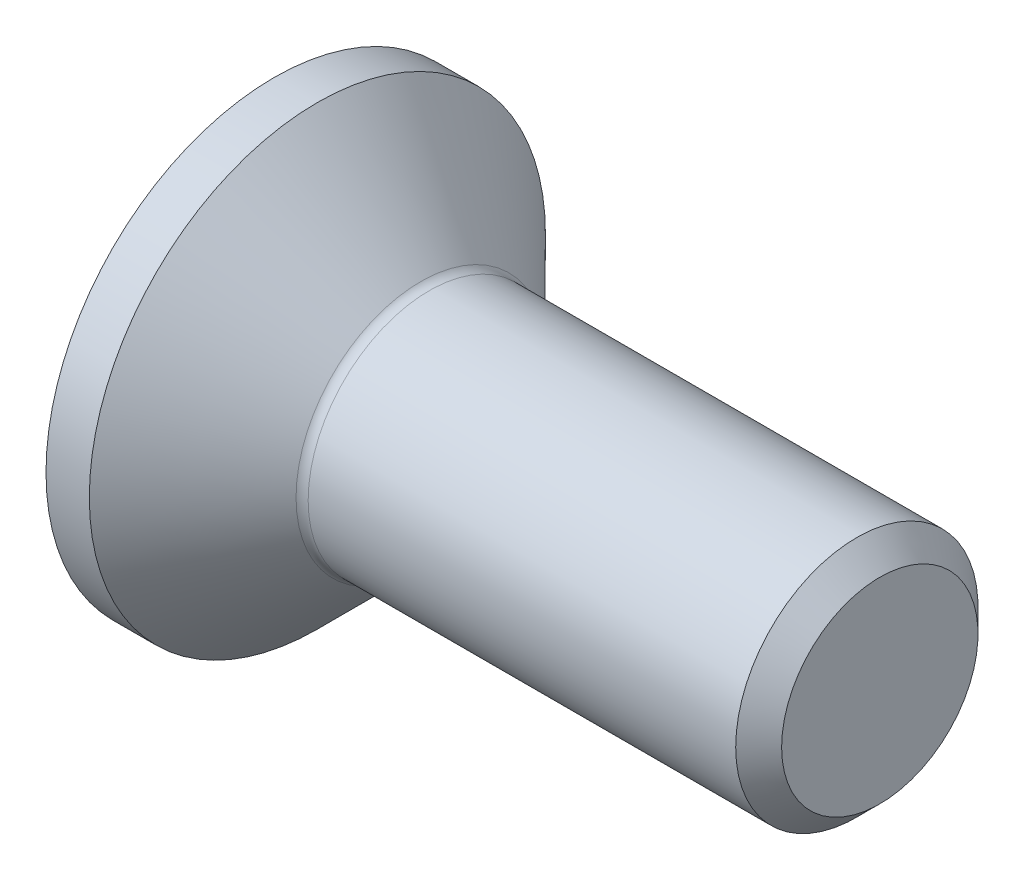
ISO-10303-21;
HEADER;
FILE_DESCRIPTION(('STEP AP214'),'2;1');
FILE_NAME('part.step','',(''),(''),'','','');
FILE_SCHEMA(('AUTOMOTIVE_DESIGN { 1 0 10303 214 1 1 1 1 }'));
ENDSEC;
DATA;
#1=APPLICATION_CONTEXT('core data for automotive mechanical design processes');
#2=APPLICATION_PROTOCOL_DEFINITION('international standard','automotive_design',2000,#1);
#3=PRODUCT_CONTEXT('',#1,'mechanical');
#4=PRODUCT('Part','Part','',(#3));
#5=PRODUCT_RELATED_PRODUCT_CATEGORY('part','',(#4));
#6=PRODUCT_DEFINITION_FORMATION('','',#4);
#7=PRODUCT_DEFINITION_CONTEXT('part definition',#1,'design');
#8=PRODUCT_DEFINITION('design','',#6,#7);
#9=PRODUCT_DEFINITION_SHAPE('','',#8);
#10=(LENGTH_UNIT() NAMED_UNIT(*) SI_UNIT(.MILLI.,.METRE.));
#11=(NAMED_UNIT(*) PLANE_ANGLE_UNIT() SI_UNIT($,.RADIAN.));
#12=(NAMED_UNIT(*) SI_UNIT($,.STERADIAN.) SOLID_ANGLE_UNIT());
#13=UNCERTAINTY_MEASURE_WITH_UNIT(LENGTH_MEASURE(1.E-05),#10,'distance_accuracy_value','');
#14=(GEOMETRIC_REPRESENTATION_CONTEXT(3) GLOBAL_UNCERTAINTY_ASSIGNED_CONTEXT((#13)) GLOBAL_UNIT_ASSIGNED_CONTEXT((#10,
#11,#12)) REPRESENTATION_CONTEXT('',''));
#15=CARTESIAN_POINT('',(0.,0.,0.));
#16=DIRECTION('',(0.,0.,1.));
#17=DIRECTION('',(1.,0.,0.));
#18=AXIS2_PLACEMENT_3D('',#15,#16,#17);
#19=CARTESIAN_POINT('',(10.,2.,0.));
#20=DIRECTION('',(-1.,0.,0.));
#21=DIRECTION('',(0.,0.,1.));
#22=AXIS2_PLACEMENT_3D('',#19,#20,#21);
#23=PLANE('',#22);
#24=CARTESIAN_POINT('',(10.,0.,0.));
#25=DIRECTION('',(-1.,0.,0.));
#26=DIRECTION('',(0.,0.,1.));
#27=AXIS2_PLACEMENT_3D('',#24,#25,#26);
#28=CIRCLE('',#27,1.62099999999999);
#29=CARTESIAN_POINT('',(10.,0.,1.62099999999999));
#30=VERTEX_POINT('',#29);
#31=EDGE_CURVE('E11',#30,#30,#28,.F.);
#32=ORIENTED_EDGE('',*,*,#31,.T.);
#33=EDGE_LOOP('',(#32));
#34=FACE_BOUND('',#33,.T.);
#35=ADVANCED_FACE('F34',(#34),#23,.F.);
#36=CARTESIAN_POINT('',(-0.587069180985524,0.,0.));
#37=DIRECTION('',(-1.,0.,0.));
#38=DIRECTION('',(0.,0.,1.));
#39=AXIS2_PLACEMENT_3D('',#36,#37,#38);
#40=CYLINDRICAL_SURFACE('',#39,2.);
#41=CARTESIAN_POINT('',(9.621,0.,0.));
#42=DIRECTION('',(-1.,0.,0.));
#43=DIRECTION('',(0.,0.,1.));
#44=AXIS2_PLACEMENT_3D('',#41,#42,#43);
#45=CIRCLE('',#44,2.);
#46=CARTESIAN_POINT('',(9.621,0.,2.));
#47=VERTEX_POINT('',#46);
#48=EDGE_CURVE('E43',#47,#47,#45,.T.);
#49=ORIENTED_EDGE('',*,*,#48,.T.);
#50=EDGE_LOOP('',(#49));
#51=FACE_BOUND('',#50,.T.);
#52=CARTESIAN_POINT('',(2.56284271247462,0.,0.));
#53=DIRECTION('',(-1.,0.,0.));
#54=DIRECTION('',(0.,0.,1.));
#55=AXIS2_PLACEMENT_3D('',#52,#53,#54);
#56=CIRCLE('',#55,2.);
#57=CARTESIAN_POINT('',(2.56284271247462,0.,2.));
#58=VERTEX_POINT('',#57);
#59=EDGE_CURVE('E147',#58,#58,#56,.F.);
#60=ORIENTED_EDGE('',*,*,#59,.T.);
#61=EDGE_LOOP('',(#60));
#62=FACE_BOUND('',#61,.T.);
#63=ADVANCED_FACE('F125',(#51,#62),#40,.T.);
#64=CARTESIAN_POINT('',(2.48,0.,0.));
#65=DIRECTION('',(-1.,0.,0.));
#66=DIRECTION('',(0.,0.,1.));
#67=AXIS2_PLACEMENT_3D('',#64,#65,#66);
#68=CONICAL_SURFACE('',#67,2.,0.785398163397448);
#69=CARTESIAN_POINT('',(0.714999999999993,0.,0.));
#70=DIRECTION('',(-1.,0.,0.));
#71=DIRECTION('',(0.,0.,1.));
#72=AXIS2_PLACEMENT_3D('',#69,#70,#71);
#73=CIRCLE('',#72,3.765);
#74=CARTESIAN_POINT('',(0.714999999999993,0.,3.765));
#75=VERTEX_POINT('',#74);
#76=EDGE_CURVE('E38',#75,#75,#73,.F.);
#77=ORIENTED_EDGE('',*,*,#76,.T.);
#78=EDGE_LOOP('',(#77));
#79=FACE_BOUND('',#78,.T.);
#80=CARTESIAN_POINT('',(2.42142135623731,0.,0.));
#81=DIRECTION('',(-1.,0.,0.));
#82=DIRECTION('',(0.,0.,1.));
#83=AXIS2_PLACEMENT_3D('',#80,#81,#82);
#84=CIRCLE('',#83,2.05857864376269);
#85=CARTESIAN_POINT('',(2.42142135623731,0.,2.05857864376269));
#86=VERTEX_POINT('',#85);
#87=EDGE_CURVE('E150',#86,#86,#84,.T.);
#88=ORIENTED_EDGE('',*,*,#87,.T.);
#89=EDGE_LOOP('',(#88));
#90=FACE_BOUND('',#89,.T.);
#91=ADVANCED_FACE('F131',(#79,#90),#68,.T.);
#92=CARTESIAN_POINT('',(2.56284271247462,0.,0.));
#93=DIRECTION('',(-1.,0.,0.));
#94=DIRECTION('',(0.,0.,1.));
#95=AXIS2_PLACEMENT_3D('',#92,#93,#94);
#96=TOROIDAL_SURFACE('',#95,2.2,0.2);
#97=ORIENTED_EDGE('',*,*,#59,.F.);
#98=EDGE_LOOP('',(#97));
#99=FACE_BOUND('',#98,.T.);
#100=ORIENTED_EDGE('',*,*,#87,.F.);
#101=EDGE_LOOP('',(#100));
#102=FACE_BOUND('',#101,.T.);
#103=ADVANCED_FACE('F135',(#99,#102),#96,.F.);
#104=CARTESIAN_POINT('',(9.621,0.,0.));
#105=DIRECTION('',(-1.,0.,0.));
#106=DIRECTION('',(0.,0.,1.));
#107=AXIS2_PLACEMENT_3D('',#104,#105,#106);
#108=CONICAL_SURFACE('',#107,2.,0.785398163397452);
#109=ORIENTED_EDGE('',*,*,#31,.F.);
#110=EDGE_LOOP('',(#109));
#111=FACE_BOUND('',#110,.T.);
#112=ORIENTED_EDGE('',*,*,#48,.F.);
#113=EDGE_LOOP('',(#112));
#114=FACE_BOUND('',#113,.T.);
#115=ADVANCED_FACE('F36',(#111,#114),#108,.T.);
#116=CARTESIAN_POINT('',(11.8531386861314,0.,0.));
#117=DIRECTION('',(1.,0.,0.));
#118=DIRECTION('',(0.,0.,-1.));
#119=AXIS2_PLACEMENT_3D('',#116,#117,#118);
#120=CYLINDRICAL_SURFACE('',#119,3.765);
#121=ORIENTED_EDGE('',*,*,#76,.F.);
#122=EDGE_LOOP('',(#121));
#123=FACE_BOUND('',#122,.T.);
#124=CARTESIAN_POINT('',(0.,0.,0.));
#125=DIRECTION('',(1.,0.,0.));
#126=DIRECTION('',(0.,0.,-1.));
#127=AXIS2_PLACEMENT_3D('',#124,#125,#126);
#128=CIRCLE('',#127,3.765);
#129=CARTESIAN_POINT('',(0.,0.,-3.765));
#130=VERTEX_POINT('',#129);
#131=EDGE_CURVE('E217',#130,#130,#128,.F.);
#132=ORIENTED_EDGE('',*,*,#131,.F.);
#133=EDGE_LOOP('',(#132));
#134=FACE_BOUND('',#133,.T.);
#135=ADVANCED_FACE('F112',(#123,#134),#120,.T.);
#136=CARTESIAN_POINT('',(2.22168783648704,0.,0.));
#137=DIRECTION('',(-1.,0.,0.));
#138=DIRECTION('',(0.,0.,1.));
#139=AXIS2_PLACEMENT_3D('',#136,#137,#138);
#140=CONICAL_SURFACE('',#139,0.,1.04719755119659);
#141=CARTESIAN_POINT('',(1.5,0.,0.));
#142=DIRECTION('',(-1.,0.,0.));
#143=DIRECTION('',(0.,0.,1.));
#144=AXIS2_PLACEMENT_3D('',#141,#142,#143);
#145=CIRCLE('',#144,1.25);
#146=CARTESIAN_POINT('',(1.5,0.625000000000001,1.08253175473055));
#147=VERTEX_POINT('',#146);
#148=CARTESIAN_POINT('',(1.5,1.25,0.));
#149=VERTEX_POINT('',#148);
#150=EDGE_CURVE('E157',#147,#149,#145,.T.);
#151=ORIENTED_EDGE('',*,*,#150,.T.);
#152=CARTESIAN_POINT('',(1.5,0.625000000000001,-1.08253175473055));
#153=VERTEX_POINT('',#152);
#154=EDGE_CURVE('E152',#149,#153,#145,.T.);
#155=ORIENTED_EDGE('',*,*,#154,.T.);
#156=CARTESIAN_POINT('',(1.5,-0.625,-1.08253175473055));
#157=VERTEX_POINT('',#156);
#158=EDGE_CURVE('E155',#153,#157,#145,.T.);
#159=ORIENTED_EDGE('',*,*,#158,.T.);
#160=CARTESIAN_POINT('',(1.5,-1.25,0.));
#161=VERTEX_POINT('',#160);
#162=EDGE_CURVE('E242',#157,#161,#145,.T.);
#163=ORIENTED_EDGE('',*,*,#162,.T.);
#164=CARTESIAN_POINT('',(1.5,-0.625,1.08253175473055));
#165=VERTEX_POINT('',#164);
#166=EDGE_CURVE('E50',#161,#165,#145,.T.);
#167=ORIENTED_EDGE('',*,*,#166,.T.);
#168=EDGE_CURVE('E166',#165,#147,#145,.T.);
#169=ORIENTED_EDGE('',*,*,#168,.T.);
#170=EDGE_LOOP('',(#151,#155,#159,#163,#167,#169));
#171=FACE_BOUND('',#170,.T.);
#172=CARTESIAN_POINT('',(2.22168783648704,0.,0.));
#173=VERTEX_POINT('',#172);
#174=VERTEX_LOOP('',#173);
#175=FACE_BOUND('',#174,.T.);
#176=ADVANCED_FACE('F109',(#171,#175),#140,.F.);
#177=CARTESIAN_POINT('',(1.5,-2.5,0.));
#178=DIRECTION('',(-1.,0.,0.));
#179=DIRECTION('',(0.,0.,1.));
#180=AXIS2_PLACEMENT_3D('',#177,#178,#179);
#181=PLANE('',#180);
#182=ORIENTED_EDGE('',*,*,#166,.F.);
#183=DIRECTION('',(0.,0.,-1.));
#184=VECTOR('',#183,1.);
#185=CARTESIAN_POINT('',(1.5,-1.25,0.721687836487031));
#186=LINE('',#185,#184);
#187=CARTESIAN_POINT('',(1.5,-1.25,0.721687836487031));
#188=VERTEX_POINT('',#187);
#189=EDGE_CURVE('E177',#188,#161,#186,.T.);
#190=ORIENTED_EDGE('',*,*,#189,.F.);
#191=DIRECTION('',(0.,-0.866025403784438,-0.5));
#192=VECTOR('',#191,1.);
#193=CARTESIAN_POINT('',(1.5,0.,1.44337567297406));
#194=LINE('',#193,#192);
#195=EDGE_CURVE('E201',#165,#188,#194,.T.);
#196=ORIENTED_EDGE('',*,*,#195,.F.);
#197=EDGE_LOOP('',(#182,#190,#196));
#198=FACE_BOUND('',#197,.T.);
#199=ADVANCED_FACE('F111',(#198),#181,.T.);
#200=ORIENTED_EDGE('',*,*,#168,.F.);
#201=CARTESIAN_POINT('',(1.5,0.,1.44337567297406));
#202=VERTEX_POINT('',#201);
#203=EDGE_CURVE('E198',#202,#165,#194,.T.);
#204=ORIENTED_EDGE('',*,*,#203,.F.);
#205=DIRECTION('',(0.,-0.866025403784438,0.5));
#206=VECTOR('',#205,1.);
#207=CARTESIAN_POINT('',(1.5,1.25,0.721687836487031));
#208=LINE('',#207,#206);
#209=EDGE_CURVE('E205',#147,#202,#208,.T.);
#210=ORIENTED_EDGE('',*,*,#209,.F.);
#211=EDGE_LOOP('',(#200,#204,#210));
#212=FACE_BOUND('',#211,.T.);
#213=ADVANCED_FACE('F118',(#212),#181,.T.);
#214=ORIENTED_EDGE('',*,*,#150,.F.);
#215=CARTESIAN_POINT('',(1.5,1.25,0.721687836487031));
#216=VERTEX_POINT('',#215);
#217=EDGE_CURVE('E202',#216,#147,#208,.T.);
#218=ORIENTED_EDGE('',*,*,#217,.F.);
#219=DIRECTION('',(0.,0.,1.));
#220=VECTOR('',#219,1.);
#221=CARTESIAN_POINT('',(1.5,1.25,-0.72168783648703));
#222=LINE('',#221,#220);
#223=EDGE_CURVE('E209',#149,#216,#222,.T.);
#224=ORIENTED_EDGE('',*,*,#223,.F.);
#225=EDGE_LOOP('',(#214,#218,#224));
#226=FACE_BOUND('',#225,.T.);
#227=ADVANCED_FACE('F273',(#226),#181,.T.);
#228=ORIENTED_EDGE('',*,*,#154,.F.);
#229=CARTESIAN_POINT('',(1.5,1.25,-0.72168783648703));
#230=VERTEX_POINT('',#229);
#231=EDGE_CURVE('E206',#230,#149,#222,.T.);
#232=ORIENTED_EDGE('',*,*,#231,.F.);
#233=DIRECTION('',(0.,0.866025403784438,0.5));
#234=VECTOR('',#233,1.);
#235=CARTESIAN_POINT('',(1.5,0.,-1.44337567297406));
#236=LINE('',#235,#234);
#237=EDGE_CURVE('E213',#153,#230,#236,.T.);
#238=ORIENTED_EDGE('',*,*,#237,.F.);
#239=EDGE_LOOP('',(#228,#232,#238));
#240=FACE_BOUND('',#239,.T.);
#241=ADVANCED_FACE('F278',(#240),#181,.T.);
#242=ORIENTED_EDGE('',*,*,#158,.F.);
#243=CARTESIAN_POINT('',(1.5,0.,-1.44337567297406));
#244=VERTEX_POINT('',#243);
#245=EDGE_CURVE('E210',#244,#153,#236,.T.);
#246=ORIENTED_EDGE('',*,*,#245,.F.);
#247=DIRECTION('',(0.,0.866025403784439,-0.5));
#248=VECTOR('',#247,1.);
#249=CARTESIAN_POINT('',(1.5,-1.25,-0.721687836487035));
#250=LINE('',#249,#248);
#251=EDGE_CURVE('E181',#157,#244,#250,.T.);
#252=ORIENTED_EDGE('',*,*,#251,.F.);
#253=EDGE_LOOP('',(#242,#246,#252));
#254=FACE_BOUND('',#253,.T.);
#255=ADVANCED_FACE('F247',(#254),#181,.T.);
#256=ORIENTED_EDGE('',*,*,#162,.F.);
#257=CARTESIAN_POINT('',(1.5,-1.25,-0.721687836487035));
#258=VERTEX_POINT('',#257);
#259=EDGE_CURVE('E214',#258,#157,#250,.T.);
#260=ORIENTED_EDGE('',*,*,#259,.F.);
#261=EDGE_CURVE('E197',#161,#258,#186,.T.);
#262=ORIENTED_EDGE('',*,*,#261,.F.);
#263=EDGE_LOOP('',(#256,#260,#262));
#264=FACE_BOUND('',#263,.T.);
#265=ADVANCED_FACE('F121',(#264),#181,.T.);
#266=CARTESIAN_POINT('',(1.5,-1.25,0.721687836487031));
#267=DIRECTION('',(0.,1.,0.));
#268=DIRECTION('',(0.,0.,1.));
#269=AXIS2_PLACEMENT_3D('',#266,#267,#268);
#270=PLANE('',#269);
#271=DIRECTION('',(0.,0.,-1.));
#272=VECTOR('',#271,1.);
#273=CARTESIAN_POINT('',(0.,-1.25,0.721687836487031));
#274=LINE('',#273,#272);
#275=CARTESIAN_POINT('',(0.,-1.25,0.721687836487031));
#276=VERTEX_POINT('',#275);
#277=CARTESIAN_POINT('',(0.,-1.25,-0.721687836487035));
#278=VERTEX_POINT('',#277);
#279=EDGE_CURVE('E178',#276,#278,#274,.T.);
#280=ORIENTED_EDGE('',*,*,#279,.F.);
#281=DIRECTION('',(-1.,0.,0.));
#282=VECTOR('',#281,1.);
#283=CARTESIAN_POINT('',(1.5,-1.25,0.721687836487031));
#284=LINE('',#283,#282);
#285=EDGE_CURVE('E173',#188,#276,#284,.T.);
#286=ORIENTED_EDGE('',*,*,#285,.F.);
#287=ORIENTED_EDGE('',*,*,#189,.T.);
#288=ORIENTED_EDGE('',*,*,#261,.T.);
#289=DIRECTION('',(-1.,0.,0.));
#290=VECTOR('',#289,1.);
#291=CARTESIAN_POINT('',(1.5,-1.25,-0.721687836487035));
#292=LINE('',#291,#290);
#293=EDGE_CURVE('E175',#258,#278,#292,.T.);
#294=ORIENTED_EDGE('',*,*,#293,.T.);
#295=EDGE_LOOP('',(#280,#286,#287,#288,#294));
#296=FACE_BOUND('',#295,.T.);
#297=ADVANCED_FACE('F236',(#296),#270,.T.);
#298=CARTESIAN_POINT('',(1.5,0.,1.44337567297406));
#299=DIRECTION('',(0.,0.500000000000001,-0.866025403784438));
#300=DIRECTION('',(0.,0.866025403784438,0.500000000000001));
#301=AXIS2_PLACEMENT_3D('',#298,#299,#300);
#302=PLANE('',#301);
#303=DIRECTION('',(0.,-0.866025403784438,-0.5));
#304=VECTOR('',#303,1.);
#305=CARTESIAN_POINT('',(0.,0.,1.44337567297406));
#306=LINE('',#305,#304);
#307=CARTESIAN_POINT('',(0.,0.,1.44337567297406));
#308=VERTEX_POINT('',#307);
#309=EDGE_CURVE('E182',#308,#276,#306,.T.);
#310=ORIENTED_EDGE('',*,*,#309,.F.);
#311=DIRECTION('',(-1.,0.,0.));
#312=VECTOR('',#311,1.);
#313=CARTESIAN_POINT('',(1.5,0.,1.44337567297406));
#314=LINE('',#313,#312);
#315=EDGE_CURVE('E171',#202,#308,#314,.T.);
#316=ORIENTED_EDGE('',*,*,#315,.F.);
#317=ORIENTED_EDGE('',*,*,#203,.T.);
#318=ORIENTED_EDGE('',*,*,#195,.T.);
#319=ORIENTED_EDGE('',*,*,#285,.T.);
#320=EDGE_LOOP('',(#310,#316,#317,#318,#319));
#321=FACE_BOUND('',#320,.T.);
#322=ADVANCED_FACE('F266',(#321),#302,.T.);
#323=CARTESIAN_POINT('',(1.5,1.25,0.721687836487031));
#324=DIRECTION('',(0.,-0.5,-0.866025403784438));
#325=DIRECTION('',(0.,0.866025403784439,-0.5));
#326=AXIS2_PLACEMENT_3D('',#323,#324,#325);
#327=PLANE('',#326);
#328=DIRECTION('',(0.,-0.866025403784438,0.5));
#329=VECTOR('',#328,1.);
#330=CARTESIAN_POINT('',(0.,1.25,0.721687836487031));
#331=LINE('',#330,#329);
#332=CARTESIAN_POINT('',(0.,1.25,0.721687836487031));
#333=VERTEX_POINT('',#332);
#334=EDGE_CURVE('E185',#333,#308,#331,.T.);
#335=ORIENTED_EDGE('',*,*,#334,.F.);
#336=DIRECTION('',(-1.,0.,0.));
#337=VECTOR('',#336,1.);
#338=CARTESIAN_POINT('',(1.5,1.25,0.721687836487031));
#339=LINE('',#338,#337);
#340=EDGE_CURVE('E169',#216,#333,#339,.T.);
#341=ORIENTED_EDGE('',*,*,#340,.F.);
#342=ORIENTED_EDGE('',*,*,#217,.T.);
#343=ORIENTED_EDGE('',*,*,#209,.T.);
#344=ORIENTED_EDGE('',*,*,#315,.T.);
#345=EDGE_LOOP('',(#335,#341,#342,#343,#344));
#346=FACE_BOUND('',#345,.T.);
#347=ADVANCED_FACE('F260',(#346),#327,.T.);
#348=CARTESIAN_POINT('',(1.5,1.25,-0.72168783648703));
#349=DIRECTION('',(0.,-1.,0.));
#350=DIRECTION('',(0.,0.,-1.));
#351=AXIS2_PLACEMENT_3D('',#348,#349,#350);
#352=PLANE('',#351);
#353=DIRECTION('',(0.,0.,1.));
#354=VECTOR('',#353,1.);
#355=CARTESIAN_POINT('',(0.,1.25,-0.72168783648703));
#356=LINE('',#355,#354);
#357=CARTESIAN_POINT('',(0.,1.25,-0.72168783648703));
#358=VERTEX_POINT('',#357);
#359=EDGE_CURVE('E188',#358,#333,#356,.T.);
#360=ORIENTED_EDGE('',*,*,#359,.F.);
#361=DIRECTION('',(-1.,0.,0.));
#362=VECTOR('',#361,1.);
#363=CARTESIAN_POINT('',(1.5,1.25,-0.72168783648703));
#364=LINE('',#363,#362);
#365=EDGE_CURVE('E167',#230,#358,#364,.T.);
#366=ORIENTED_EDGE('',*,*,#365,.F.);
#367=ORIENTED_EDGE('',*,*,#231,.T.);
#368=ORIENTED_EDGE('',*,*,#223,.T.);
#369=ORIENTED_EDGE('',*,*,#340,.T.);
#370=EDGE_LOOP('',(#360,#366,#367,#368,#369));
#371=FACE_BOUND('',#370,.T.);
#372=ADVANCED_FACE('F256',(#371),#352,.T.);
#373=CARTESIAN_POINT('',(1.5,0.,-1.44337567297406));
#374=DIRECTION('',(0.,-0.5,0.866025403784438));
#375=DIRECTION('',(0.,-0.866025403784439,-0.5));
#376=AXIS2_PLACEMENT_3D('',#373,#374,#375);
#377=PLANE('',#376);
#378=DIRECTION('',(0.,0.866025403784438,0.5));
#379=VECTOR('',#378,1.);
#380=CARTESIAN_POINT('',(0.,0.,-1.44337567297406));
#381=LINE('',#380,#379);
#382=CARTESIAN_POINT('',(0.,0.,-1.44337567297406));
#383=VERTEX_POINT('',#382);
#384=EDGE_CURVE('E191',#383,#358,#381,.T.);
#385=ORIENTED_EDGE('',*,*,#384,.F.);
#386=DIRECTION('',(-1.,0.,0.));
#387=VECTOR('',#386,1.);
#388=CARTESIAN_POINT('',(1.5,0.,-1.44337567297406));
#389=LINE('',#388,#387);
#390=EDGE_CURVE('E159',#244,#383,#389,.T.);
#391=ORIENTED_EDGE('',*,*,#390,.F.);
#392=ORIENTED_EDGE('',*,*,#245,.T.);
#393=ORIENTED_EDGE('',*,*,#237,.T.);
#394=ORIENTED_EDGE('',*,*,#365,.T.);
#395=EDGE_LOOP('',(#385,#391,#392,#393,#394));
#396=FACE_BOUND('',#395,.T.);
#397=ADVANCED_FACE('F251',(#396),#377,.T.);
#398=CARTESIAN_POINT('',(1.5,-1.25,-0.721687836487035));
#399=DIRECTION('',(0.,0.5,0.866025403784438));
#400=DIRECTION('',(0.,-0.866025403784439,0.5));
#401=AXIS2_PLACEMENT_3D('',#398,#399,#400);
#402=PLANE('',#401);
#403=DIRECTION('',(0.,0.866025403784439,-0.5));
#404=VECTOR('',#403,1.);
#405=CARTESIAN_POINT('',(0.,-1.25,-0.721687836487035));
#406=LINE('',#405,#404);
#407=EDGE_CURVE('E58',#278,#383,#406,.T.);
#408=ORIENTED_EDGE('',*,*,#407,.F.);
#409=ORIENTED_EDGE('',*,*,#293,.F.);
#410=ORIENTED_EDGE('',*,*,#259,.T.);
#411=ORIENTED_EDGE('',*,*,#251,.T.);
#412=ORIENTED_EDGE('',*,*,#390,.T.);
#413=EDGE_LOOP('',(#408,#409,#410,#411,#412));
#414=FACE_BOUND('',#413,.T.);
#415=ADVANCED_FACE('F230',(#414),#402,.T.);
#416=CARTESIAN_POINT('',(0.,0.,0.));
#417=DIRECTION('',(1.,0.,0.));
#418=DIRECTION('',(0.,0.,-1.));
#419=AXIS2_PLACEMENT_3D('',#416,#417,#418);
#420=PLANE('',#419);
#421=ORIENTED_EDGE('',*,*,#131,.T.);
#422=EDGE_LOOP('',(#421));
#423=FACE_BOUND('',#422,.T.);
#424=ORIENTED_EDGE('',*,*,#407,.T.);
#425=ORIENTED_EDGE('',*,*,#384,.T.);
#426=ORIENTED_EDGE('',*,*,#359,.T.);
#427=ORIENTED_EDGE('',*,*,#334,.T.);
#428=ORIENTED_EDGE('',*,*,#309,.T.);
#429=ORIENTED_EDGE('',*,*,#279,.T.);
#430=EDGE_LOOP('',(#424,#425,#426,#427,#428,#429));
#431=FACE_BOUND('',#430,.T.);
#432=ADVANCED_FACE('F227',(#423,#431),#420,.F.);
#433=CLOSED_SHELL('',(#35,#63,#91,#103,#115,#135,#176,#199,#213,#227,#241,#255,#265,#297,#322,
#347,#372,#397,#415,#432));
#434=MANIFOLD_SOLID_BREP('B2',#433);
#435=ADVANCED_BREP_SHAPE_REPRESENTATION('',(#18,#434),#14);
#436=SHAPE_DEFINITION_REPRESENTATION(#9,#435);
ENDSEC;
END-ISO-10303-21;
